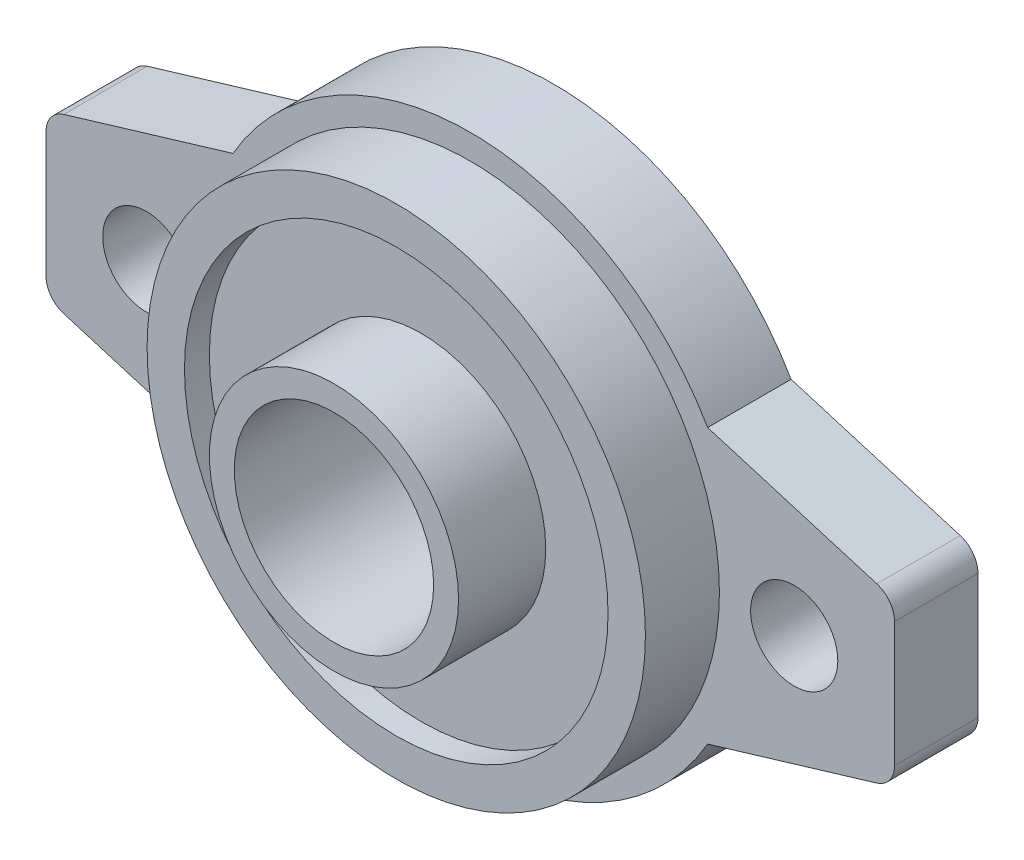
ISO-10303-21;
HEADER;
FILE_DESCRIPTION(('STEP AP214'),'2;1');
FILE_NAME('part.step','',(''),(''),'','','');
FILE_SCHEMA(('AUTOMOTIVE_DESIGN { 1 0 10303 214 1 1 1 1 }'));
ENDSEC;
DATA;
#1=APPLICATION_CONTEXT('core data for automotive mechanical design processes');
#2=APPLICATION_PROTOCOL_DEFINITION('international standard','automotive_design',2000,#1);
#3=PRODUCT_CONTEXT('',#1,'mechanical');
#4=PRODUCT('Part','Part','',(#3));
#5=PRODUCT_RELATED_PRODUCT_CATEGORY('part','',(#4));
#6=PRODUCT_DEFINITION_FORMATION('','',#4);
#7=PRODUCT_DEFINITION_CONTEXT('part definition',#1,'design');
#8=PRODUCT_DEFINITION('design','',#6,#7);
#9=PRODUCT_DEFINITION_SHAPE('','',#8);
#10=(LENGTH_UNIT() NAMED_UNIT(*) SI_UNIT(.MILLI.,.METRE.));
#11=(NAMED_UNIT(*) PLANE_ANGLE_UNIT() SI_UNIT($,.RADIAN.));
#12=(NAMED_UNIT(*) SI_UNIT($,.STERADIAN.) SOLID_ANGLE_UNIT());
#13=UNCERTAINTY_MEASURE_WITH_UNIT(LENGTH_MEASURE(1.E-05),#10,'distance_accuracy_value','');
#14=(GEOMETRIC_REPRESENTATION_CONTEXT(3) GLOBAL_UNCERTAINTY_ASSIGNED_CONTEXT((#13)) GLOBAL_UNIT_ASSIGNED_CONTEXT((#10,
#11,#12)) REPRESENTATION_CONTEXT('',''));
#15=CARTESIAN_POINT('',(0.,0.,0.));
#16=DIRECTION('',(0.,0.,1.));
#17=DIRECTION('',(1.,0.,0.));
#18=AXIS2_PLACEMENT_3D('',#15,#16,#17);
#19=CARTESIAN_POINT('',(0.,0.,6.7));
#20=DIRECTION('',(0.,0.,-1.));
#21=DIRECTION('',(-1.,0.,0.));
#22=AXIS2_PLACEMENT_3D('',#19,#20,#21);
#23=CYLINDRICAL_SURFACE('',#22,22.);
#24=CARTESIAN_POINT('',(0.,0.,0.));
#25=DIRECTION('',(0.,0.,1.));
#26=DIRECTION('',(1.,0.,0.));
#27=AXIS2_PLACEMENT_3D('',#24,#25,#26);
#28=CIRCLE('',#27,22.);
#29=CARTESIAN_POINT('',(-19.0525588832576,-11.,0.));
#30=VERTEX_POINT('',#29);
#31=CARTESIAN_POINT('',(19.0525588832577,-11.,0.));
#32=VERTEX_POINT('',#31);
#33=EDGE_CURVE('E313',#30,#32,#28,.T.);
#34=ORIENTED_EDGE('',*,*,#33,.T.);
#35=DIRECTION('',(0.,0.,-1.));
#36=VECTOR('',#35,1.);
#37=CARTESIAN_POINT('',(19.0525588832577,-11.,6.7));
#38=LINE('',#37,#36);
#39=CARTESIAN_POINT('',(19.0525588832577,-11.,6.7));
#40=VERTEX_POINT('',#39);
#41=EDGE_CURVE('E217',#40,#32,#38,.T.);
#42=ORIENTED_EDGE('',*,*,#41,.F.);
#43=CARTESIAN_POINT('',(0.,0.,6.7));
#44=DIRECTION('',(0.,0.,1.));
#45=DIRECTION('',(1.,0.,0.));
#46=AXIS2_PLACEMENT_3D('',#43,#44,#45);
#47=CIRCLE('',#46,22.);
#48=CARTESIAN_POINT('',(-19.0525588832576,-11.,6.7));
#49=VERTEX_POINT('',#48);
#50=EDGE_CURVE('E201',#49,#40,#47,.T.);
#51=ORIENTED_EDGE('',*,*,#50,.F.);
#52=DIRECTION('',(0.,0.,-1.));
#53=VECTOR('',#52,1.);
#54=CARTESIAN_POINT('',(-19.0525588832576,-11.,6.7));
#55=LINE('',#54,#53);
#56=EDGE_CURVE('E215',#49,#30,#55,.T.);
#57=ORIENTED_EDGE('',*,*,#56,.T.);
#58=EDGE_LOOP('',(#34,#42,#51,#57));
#59=FACE_BOUND('',#58,.T.);
#60=ADVANCED_FACE('F103',(#59),#23,.T.);
#61=CARTESIAN_POINT('',(4.60066999953504,-15.3355666651168,6.7));
#62=DIRECTION('',(0.287347885566346,-0.957826285221151,0.));
#63=DIRECTION('',(0.957826285221151,0.287347885566346,0.));
#64=AXIS2_PLACEMENT_3D('',#61,#62,#63);
#65=PLANE('',#64);
#66=DIRECTION('',(-0.957826285221151,-0.287347885566345,0.));
#67=VECTOR('',#66,1.);
#68=CARTESIAN_POINT('',(4.60066999953504,-15.3355666651168,0.));
#69=LINE('',#68,#67);
#70=CARTESIAN_POINT('',(32.6272546543903,-6.9275912686602,0.));
#71=VERTEX_POINT('',#70);
#72=EDGE_CURVE('E287',#71,#32,#69,.T.);
#73=ORIENTED_EDGE('',*,*,#72,.F.);
#74=DIRECTION('',(0.,0.,-1.));
#75=VECTOR('',#74,1.);
#76=CARTESIAN_POINT('',(32.6272546543903,-6.9275912686602,6.7));
#77=LINE('',#76,#75);
#78=CARTESIAN_POINT('',(32.6272546543903,-6.9275912686602,6.7));
#79=VERTEX_POINT('',#78);
#80=EDGE_CURVE('E112',#71,#79,#77,.F.);
#81=ORIENTED_EDGE('',*,*,#80,.T.);
#82=DIRECTION('',(-0.957826285221151,-0.287347885566345,0.));
#83=VECTOR('',#82,1.);
#84=CARTESIAN_POINT('',(4.60066999953504,-15.3355666651168,6.7));
#85=LINE('',#84,#83);
#86=EDGE_CURVE('E219',#79,#40,#85,.T.);
#87=ORIENTED_EDGE('',*,*,#86,.T.);
#88=ORIENTED_EDGE('',*,*,#41,.T.);
#89=EDGE_LOOP('',(#73,#81,#87,#88));
#90=FACE_BOUND('',#89,.T.);
#91=ADVANCED_FACE('F286',(#90),#65,.T.);
#92=CARTESIAN_POINT('',(34.0525588832577,0.,6.7));
#93=DIRECTION('',(1.,0.,0.));
#94=DIRECTION('',(0.,0.,-1.));
#95=AXIS2_PLACEMENT_3D('',#92,#93,#94);
#96=PLANE('',#95);
#97=DIRECTION('',(0.,-1.,0.));
#98=VECTOR('',#97,1.);
#99=CARTESIAN_POINT('',(34.0525588832577,0.,6.7));
#100=LINE('',#99,#98);
#101=CARTESIAN_POINT('',(34.0525588832577,5.01193869821789,6.7));
#102=VERTEX_POINT('',#101);
#103=CARTESIAN_POINT('',(34.0525588832577,-5.01193869821789,6.7));
#104=VERTEX_POINT('',#103);
#105=EDGE_CURVE('E292',#102,#104,#100,.T.);
#106=ORIENTED_EDGE('',*,*,#105,.T.);
#107=DIRECTION('',(0.,0.,-1.));
#108=VECTOR('',#107,1.);
#109=CARTESIAN_POINT('',(34.0525588832577,-5.01193869821789,6.7));
#110=LINE('',#109,#108);
#111=CARTESIAN_POINT('',(34.0525588832577,-5.01193869821789,0.));
#112=VERTEX_POINT('',#111);
#113=EDGE_CURVE('E279',#104,#112,#110,.T.);
#114=ORIENTED_EDGE('',*,*,#113,.T.);
#115=DIRECTION('',(0.,-1.,0.));
#116=VECTOR('',#115,1.);
#117=CARTESIAN_POINT('',(34.0525588832577,0.,0.));
#118=LINE('',#117,#116);
#119=CARTESIAN_POINT('',(34.0525588832577,5.01193869821789,0.));
#120=VERTEX_POINT('',#119);
#121=EDGE_CURVE('E300',#120,#112,#118,.T.);
#122=ORIENTED_EDGE('',*,*,#121,.F.);
#123=DIRECTION('',(0.,0.,-1.));
#124=VECTOR('',#123,1.);
#125=CARTESIAN_POINT('',(34.0525588832577,5.01193869821789,6.7));
#126=LINE('',#125,#124);
#127=EDGE_CURVE('E276',#120,#102,#126,.F.);
#128=ORIENTED_EDGE('',*,*,#127,.T.);
#129=EDGE_LOOP('',(#106,#114,#122,#128));
#130=FACE_BOUND('',#129,.T.);
#131=ADVANCED_FACE('F299',(#130),#96,.T.);
#132=CARTESIAN_POINT('',(4.60066999953503,15.3355666651168,6.7));
#133=DIRECTION('',(0.287347885566345,0.957826285221151,0.));
#134=DIRECTION('',(-0.957826285221151,0.287347885566345,0.));
#135=AXIS2_PLACEMENT_3D('',#132,#133,#134);
#136=PLANE('',#135);
#137=DIRECTION('',(0.957826285221151,-0.287347885566345,0.));
#138=VECTOR('',#137,1.);
#139=CARTESIAN_POINT('',(4.60066999953503,15.3355666651168,6.7));
#140=LINE('',#139,#138);
#141=CARTESIAN_POINT('',(19.0525588832577,11.,6.7));
#142=VERTEX_POINT('',#141);
#143=CARTESIAN_POINT('',(32.6272546543904,6.92759126866019,6.7));
#144=VERTEX_POINT('',#143);
#145=EDGE_CURVE('E343',#142,#144,#140,.T.);
#146=ORIENTED_EDGE('',*,*,#145,.T.);
#147=DIRECTION('',(0.,0.,-1.));
#148=VECTOR('',#147,1.);
#149=CARTESIAN_POINT('',(32.6272546543904,6.92759126866019,6.7));
#150=LINE('',#149,#148);
#151=CARTESIAN_POINT('',(32.6272546543904,6.92759126866019,0.));
#152=VERTEX_POINT('',#151);
#153=EDGE_CURVE('E13',#144,#152,#150,.T.);
#154=ORIENTED_EDGE('',*,*,#153,.T.);
#155=DIRECTION('',(0.957826285221151,-0.287347885566345,0.));
#156=VECTOR('',#155,1.);
#157=CARTESIAN_POINT('',(4.60066999953503,15.3355666651168,0.));
#158=LINE('',#157,#156);
#159=CARTESIAN_POINT('',(19.0525588832577,11.,0.));
#160=VERTEX_POINT('',#159);
#161=EDGE_CURVE('E307',#160,#152,#158,.T.);
#162=ORIENTED_EDGE('',*,*,#161,.F.);
#163=DIRECTION('',(0.,0.,-1.));
#164=VECTOR('',#163,1.);
#165=CARTESIAN_POINT('',(19.0525588832577,11.,6.7));
#166=LINE('',#165,#164);
#167=EDGE_CURVE('E233',#142,#160,#166,.T.);
#168=ORIENTED_EDGE('',*,*,#167,.F.);
#169=EDGE_LOOP('',(#146,#154,#162,#168));
#170=FACE_BOUND('',#169,.T.);
#171=ADVANCED_FACE('F341',(#170),#136,.T.);
#172=CARTESIAN_POINT('',(0.,0.,6.7));
#173=DIRECTION('',(0.,0.,-1.));
#174=DIRECTION('',(-1.,0.,0.));
#175=AXIS2_PLACEMENT_3D('',#172,#173,#174);
#176=CYLINDRICAL_SURFACE('',#175,22.);
#177=CARTESIAN_POINT('',(0.,0.,0.));
#178=DIRECTION('',(0.,0.,1.));
#179=DIRECTION('',(1.,0.,0.));
#180=AXIS2_PLACEMENT_3D('',#177,#178,#179);
#181=CIRCLE('',#180,22.);
#182=CARTESIAN_POINT('',(-19.0525588832577,11.,0.));
#183=VERTEX_POINT('',#182);
#184=EDGE_CURVE('E311',#160,#183,#181,.T.);
#185=ORIENTED_EDGE('',*,*,#184,.T.);
#186=DIRECTION('',(0.,0.,-1.));
#187=VECTOR('',#186,1.);
#188=CARTESIAN_POINT('',(-19.0525588832577,11.,6.7));
#189=LINE('',#188,#187);
#190=CARTESIAN_POINT('',(-19.0525588832577,11.,6.7));
#191=VERTEX_POINT('',#190);
#192=EDGE_CURVE('E327',#191,#183,#189,.T.);
#193=ORIENTED_EDGE('',*,*,#192,.F.);
#194=CARTESIAN_POINT('',(0.,0.,6.7));
#195=DIRECTION('',(0.,0.,1.));
#196=DIRECTION('',(1.,0.,0.));
#197=AXIS2_PLACEMENT_3D('',#194,#195,#196);
#198=CIRCLE('',#197,22.);
#199=EDGE_CURVE('E337',#142,#191,#198,.T.);
#200=ORIENTED_EDGE('',*,*,#199,.F.);
#201=ORIENTED_EDGE('',*,*,#167,.T.);
#202=EDGE_LOOP('',(#185,#193,#200,#201));
#203=FACE_BOUND('',#202,.T.);
#204=ADVANCED_FACE('F335',(#203),#176,.T.);
#205=CARTESIAN_POINT('',(-4.60066999953503,15.3355666651168,6.7));
#206=DIRECTION('',(0.287347885566345,-0.957826285221151,0.));
#207=DIRECTION('',(0.957826285221151,0.287347885566345,0.));
#208=AXIS2_PLACEMENT_3D('',#205,#206,#207);
#209=PLANE('',#208);
#210=DIRECTION('',(-0.957826285221151,-0.287347885566345,0.));
#211=VECTOR('',#210,1.);
#212=CARTESIAN_POINT('',(-4.60066999953503,15.3355666651168,0.));
#213=LINE('',#212,#211);
#214=CARTESIAN_POINT('',(-32.6272546543904,6.92759126866018,0.));
#215=VERTEX_POINT('',#214);
#216=EDGE_CURVE('E319',#183,#215,#213,.T.);
#217=ORIENTED_EDGE('',*,*,#216,.T.);
#218=DIRECTION('',(0.,0.,-1.));
#219=VECTOR('',#218,1.);
#220=CARTESIAN_POINT('',(-32.6272546543904,6.92759126866018,6.7));
#221=LINE('',#220,#219);
#222=CARTESIAN_POINT('',(-32.6272546543904,6.92759126866018,6.7));
#223=VERTEX_POINT('',#222);
#224=EDGE_CURVE('E119',#215,#223,#221,.F.);
#225=ORIENTED_EDGE('',*,*,#224,.T.);
#226=DIRECTION('',(-0.957826285221151,-0.287347885566345,0.));
#227=VECTOR('',#226,1.);
#228=CARTESIAN_POINT('',(-4.60066999953503,15.3355666651168,6.7));
#229=LINE('',#228,#227);
#230=EDGE_CURVE('E352',#191,#223,#229,.T.);
#231=ORIENTED_EDGE('',*,*,#230,.F.);
#232=ORIENTED_EDGE('',*,*,#192,.T.);
#233=EDGE_LOOP('',(#217,#225,#231,#232));
#234=FACE_BOUND('',#233,.T.);
#235=ADVANCED_FACE('F482',(#234),#209,.F.);
#236=CARTESIAN_POINT('',(-34.0525588832577,0.,6.7));
#237=DIRECTION('',(1.,0.,0.));
#238=DIRECTION('',(0.,0.,-1.));
#239=AXIS2_PLACEMENT_3D('',#236,#237,#238);
#240=PLANE('',#239);
#241=DIRECTION('',(0.,-1.,0.));
#242=VECTOR('',#241,1.);
#243=CARTESIAN_POINT('',(-34.0525588832577,0.,0.));
#244=LINE('',#243,#242);
#245=CARTESIAN_POINT('',(-34.0525588832577,5.01193869821788,0.));
#246=VERTEX_POINT('',#245);
#247=CARTESIAN_POINT('',(-34.0525588832577,-5.0119386982179,0.));
#248=VERTEX_POINT('',#247);
#249=EDGE_CURVE('E322',#246,#248,#244,.T.);
#250=ORIENTED_EDGE('',*,*,#249,.T.);
#251=DIRECTION('',(0.,0.,-1.));
#252=VECTOR('',#251,1.);
#253=CARTESIAN_POINT('',(-34.0525588832577,-5.0119386982179,6.7));
#254=LINE('',#253,#252);
#255=CARTESIAN_POINT('',(-34.0525588832577,-5.0119386982179,6.7));
#256=VERTEX_POINT('',#255);
#257=EDGE_CURVE('E261',#248,#256,#254,.F.);
#258=ORIENTED_EDGE('',*,*,#257,.T.);
#259=DIRECTION('',(0.,-1.,0.));
#260=VECTOR('',#259,1.);
#261=CARTESIAN_POINT('',(-34.0525588832577,0.,6.7));
#262=LINE('',#261,#260);
#263=CARTESIAN_POINT('',(-34.0525588832577,5.01193869821788,6.7));
#264=VERTEX_POINT('',#263);
#265=EDGE_CURVE('E330',#264,#256,#262,.T.);
#266=ORIENTED_EDGE('',*,*,#265,.F.);
#267=DIRECTION('',(0.,0.,-1.));
#268=VECTOR('',#267,1.);
#269=CARTESIAN_POINT('',(-34.0525588832577,5.01193869821788,6.7));
#270=LINE('',#269,#268);
#271=EDGE_CURVE('E257',#264,#246,#270,.T.);
#272=ORIENTED_EDGE('',*,*,#271,.T.);
#273=EDGE_LOOP('',(#250,#258,#266,#272));
#274=FACE_BOUND('',#273,.T.);
#275=ADVANCED_FACE('F370',(#274),#240,.F.);
#276=CARTESIAN_POINT('',(-4.60066999953503,-15.3355666651168,6.7));
#277=DIRECTION('',(0.287347885566345,0.957826285221151,0.));
#278=DIRECTION('',(-0.957826285221152,0.287347885566345,0.));
#279=AXIS2_PLACEMENT_3D('',#276,#277,#278);
#280=PLANE('',#279);
#281=DIRECTION('',(0.957826285221152,-0.287347885566345,0.));
#282=VECTOR('',#281,1.);
#283=CARTESIAN_POINT('',(-4.60066999953503,-15.3355666651168,6.7));
#284=LINE('',#283,#282);
#285=CARTESIAN_POINT('',(-32.6272546543904,-6.9275912686602,6.7));
#286=VERTEX_POINT('',#285);
#287=EDGE_CURVE('E196',#286,#49,#284,.T.);
#288=ORIENTED_EDGE('',*,*,#287,.F.);
#289=DIRECTION('',(0.,0.,-1.));
#290=VECTOR('',#289,1.);
#291=CARTESIAN_POINT('',(-32.6272546543903,-6.9275912686602,6.7));
#292=LINE('',#291,#290);
#293=CARTESIAN_POINT('',(-32.6272546543904,-6.9275912686602,0.));
#294=VERTEX_POINT('',#293);
#295=EDGE_CURVE('E231',#286,#294,#292,.T.);
#296=ORIENTED_EDGE('',*,*,#295,.T.);
#297=DIRECTION('',(0.957826285221152,-0.287347885566345,0.));
#298=VECTOR('',#297,1.);
#299=CARTESIAN_POINT('',(-4.60066999953503,-15.3355666651168,0.));
#300=LINE('',#299,#298);
#301=EDGE_CURVE('E223',#294,#30,#300,.T.);
#302=ORIENTED_EDGE('',*,*,#301,.T.);
#303=ORIENTED_EDGE('',*,*,#56,.F.);
#304=EDGE_LOOP('',(#288,#296,#302,#303));
#305=FACE_BOUND('',#304,.T.);
#306=ADVANCED_FACE('F221',(#305),#280,.F.);
#307=CARTESIAN_POINT('',(26.,0.,6.7));
#308=DIRECTION('',(0.,0.,-1.));
#309=DIRECTION('',(-1.,0.,0.));
#310=AXIS2_PLACEMENT_3D('',#307,#308,#309);
#311=CYLINDRICAL_SURFACE('',#310,3.5);
#312=CARTESIAN_POINT('',(26.,0.,6.7));
#313=DIRECTION('',(0.,0.,1.));
#314=DIRECTION('',(1.,0.,0.));
#315=AXIS2_PLACEMENT_3D('',#312,#313,#314);
#316=CIRCLE('',#315,3.5);
#317=CARTESIAN_POINT('',(29.5,0.,6.7));
#318=VERTEX_POINT('',#317);
#319=EDGE_CURVE('E210',#318,#318,#316,.T.);
#320=ORIENTED_EDGE('',*,*,#319,.T.);
#321=EDGE_LOOP('',(#320));
#322=FACE_BOUND('',#321,.T.);
#323=CARTESIAN_POINT('',(26.,0.,0.));
#324=DIRECTION('',(0.,0.,1.));
#325=DIRECTION('',(1.,0.,0.));
#326=AXIS2_PLACEMENT_3D('',#323,#324,#325);
#327=CIRCLE('',#326,3.5);
#328=CARTESIAN_POINT('',(29.5,0.,0.));
#329=VERTEX_POINT('',#328);
#330=EDGE_CURVE('E360',#329,#329,#327,.T.);
#331=ORIENTED_EDGE('',*,*,#330,.F.);
#332=EDGE_LOOP('',(#331));
#333=FACE_BOUND('',#332,.T.);
#334=ADVANCED_FACE('F398',(#322,#333),#311,.F.);
#335=CARTESIAN_POINT('',(-26.,0.,6.7));
#336=DIRECTION('',(0.,0.,-1.));
#337=DIRECTION('',(-1.,0.,0.));
#338=AXIS2_PLACEMENT_3D('',#335,#336,#337);
#339=CYLINDRICAL_SURFACE('',#338,3.5);
#340=CARTESIAN_POINT('',(-26.,0.,6.7));
#341=DIRECTION('',(0.,0.,1.));
#342=DIRECTION('',(1.,0.,0.));
#343=AXIS2_PLACEMENT_3D('',#340,#341,#342);
#344=CIRCLE('',#343,3.5);
#345=CARTESIAN_POINT('',(-22.5,0.,6.7));
#346=VERTEX_POINT('',#345);
#347=EDGE_CURVE('E326',#346,#346,#344,.F.);
#348=ORIENTED_EDGE('',*,*,#347,.F.);
#349=EDGE_LOOP('',(#348));
#350=FACE_BOUND('',#349,.T.);
#351=CARTESIAN_POINT('',(-26.,0.,0.));
#352=DIRECTION('',(0.,0.,1.));
#353=DIRECTION('',(1.,0.,0.));
#354=AXIS2_PLACEMENT_3D('',#351,#352,#353);
#355=CIRCLE('',#354,3.5);
#356=CARTESIAN_POINT('',(-22.5,0.,0.));
#357=VERTEX_POINT('',#356);
#358=EDGE_CURVE('E240',#357,#357,#355,.F.);
#359=ORIENTED_EDGE('',*,*,#358,.T.);
#360=EDGE_LOOP('',(#359));
#361=FACE_BOUND('',#360,.T.);
#362=ADVANCED_FACE('F400',(#350,#361),#339,.F.);
#363=CARTESIAN_POINT('',(0.,0.,0.));
#364=DIRECTION('',(0.,0.,1.));
#365=DIRECTION('',(1.,0.,0.));
#366=AXIS2_PLACEMENT_3D('',#363,#364,#365);
#367=PLANE('',#366);
#368=ORIENTED_EDGE('',*,*,#358,.F.);
#369=EDGE_LOOP('',(#368));
#370=FACE_BOUND('',#369,.T.);
#371=ORIENTED_EDGE('',*,*,#330,.T.);
#372=EDGE_LOOP('',(#371));
#373=FACE_BOUND('',#372,.T.);
#374=ORIENTED_EDGE('',*,*,#301,.F.);
#375=CARTESIAN_POINT('',(-32.0525588832577,-5.0119386982179,0.));
#376=DIRECTION('',(0.,0.,1.));
#377=DIRECTION('',(1.,0.,0.));
#378=AXIS2_PLACEMENT_3D('',#375,#376,#377);
#379=CIRCLE('',#378,2.);
#380=EDGE_CURVE('E254',#294,#248,#379,.F.);
#381=ORIENTED_EDGE('',*,*,#380,.T.);
#382=ORIENTED_EDGE('',*,*,#249,.F.);
#383=CARTESIAN_POINT('',(-32.0525588832577,5.01193869821788,0.));
#384=DIRECTION('',(0.,0.,1.));
#385=DIRECTION('',(1.,0.,0.));
#386=AXIS2_PLACEMENT_3D('',#383,#384,#385);
#387=CIRCLE('',#386,2.);
#388=EDGE_CURVE('E251',#246,#215,#387,.F.);
#389=ORIENTED_EDGE('',*,*,#388,.T.);
#390=ORIENTED_EDGE('',*,*,#216,.F.);
#391=ORIENTED_EDGE('',*,*,#184,.F.);
#392=ORIENTED_EDGE('',*,*,#161,.T.);
#393=CARTESIAN_POINT('',(32.0525588832577,5.01193869821789,0.));
#394=DIRECTION('',(0.,0.,1.));
#395=DIRECTION('',(1.,0.,0.));
#396=AXIS2_PLACEMENT_3D('',#393,#394,#395);
#397=CIRCLE('',#396,2.);
#398=EDGE_CURVE('E245',#152,#120,#397,.F.);
#399=ORIENTED_EDGE('',*,*,#398,.T.);
#400=ORIENTED_EDGE('',*,*,#121,.T.);
#401=CARTESIAN_POINT('',(32.0525588832577,-5.01193869821789,0.));
#402=DIRECTION('',(0.,0.,1.));
#403=DIRECTION('',(1.,0.,0.));
#404=AXIS2_PLACEMENT_3D('',#401,#402,#403);
#405=CIRCLE('',#404,2.);
#406=EDGE_CURVE('E248',#112,#71,#405,.F.);
#407=ORIENTED_EDGE('',*,*,#406,.T.);
#408=ORIENTED_EDGE('',*,*,#72,.T.);
#409=ORIENTED_EDGE('',*,*,#33,.F.);
#410=EDGE_LOOP('',(#374,#381,#382,#389,#390,#391,#392,#399,#400,#407,#408,#409));
#411=FACE_BOUND('',#410,.T.);
#412=CARTESIAN_POINT('',(0.,0.,0.));
#413=DIRECTION('',(0.,0.,1.));
#414=DIRECTION('',(1.,0.,0.));
#415=AXIS2_PLACEMENT_3D('',#412,#413,#414);
#416=CIRCLE('',#415,8.);
#417=CARTESIAN_POINT('',(8.,0.,0.));
#418=VERTEX_POINT('',#417);
#419=EDGE_CURVE('E439',#418,#418,#416,.T.);
#420=ORIENTED_EDGE('',*,*,#419,.T.);
#421=EDGE_LOOP('',(#420));
#422=FACE_BOUND('',#421,.T.);
#423=ADVANCED_FACE('F303',(#370,#373,#411,#422),#367,.F.);
#424=CARTESIAN_POINT('',(0.,0.,6.7));
#425=DIRECTION('',(0.,0.,1.));
#426=DIRECTION('',(1.,0.,0.));
#427=AXIS2_PLACEMENT_3D('',#424,#425,#426);
#428=PLANE('',#427);
#429=CARTESIAN_POINT('',(0.,0.,6.7));
#430=DIRECTION('',(0.,0.,1.));
#431=DIRECTION('',(1.,0.,0.));
#432=AXIS2_PLACEMENT_3D('',#429,#430,#431);
#433=CIRCLE('',#432,20.);
#434=CARTESIAN_POINT('',(-20.,0.,6.7));
#435=VERTEX_POINT('',#434);
#436=EDGE_CURVE('E237',#435,#435,#433,.F.);
#437=ORIENTED_EDGE('',*,*,#436,.T.);
#438=EDGE_LOOP('',(#437));
#439=FACE_BOUND('',#438,.T.);
#440=ORIENTED_EDGE('',*,*,#347,.T.);
#441=EDGE_LOOP('',(#440));
#442=FACE_BOUND('',#441,.T.);
#443=ORIENTED_EDGE('',*,*,#319,.F.);
#444=EDGE_LOOP('',(#443));
#445=FACE_BOUND('',#444,.T.);
#446=ORIENTED_EDGE('',*,*,#265,.T.);
#447=CARTESIAN_POINT('',(-32.0525588832577,-5.0119386982179,6.7));
#448=DIRECTION('',(0.,0.,1.));
#449=DIRECTION('',(1.,0.,0.));
#450=AXIS2_PLACEMENT_3D('',#447,#448,#449);
#451=CIRCLE('',#450,2.);
#452=EDGE_CURVE('E204',#256,#286,#451,.T.);
#453=ORIENTED_EDGE('',*,*,#452,.T.);
#454=ORIENTED_EDGE('',*,*,#287,.T.);
#455=ORIENTED_EDGE('',*,*,#50,.T.);
#456=ORIENTED_EDGE('',*,*,#86,.F.);
#457=CARTESIAN_POINT('',(32.0525588832577,-5.01193869821789,6.7));
#458=DIRECTION('',(0.,0.,1.));
#459=DIRECTION('',(1.,0.,0.));
#460=AXIS2_PLACEMENT_3D('',#457,#458,#459);
#461=CIRCLE('',#460,2.);
#462=EDGE_CURVE('E266',#79,#104,#461,.T.);
#463=ORIENTED_EDGE('',*,*,#462,.T.);
#464=ORIENTED_EDGE('',*,*,#105,.F.);
#465=CARTESIAN_POINT('',(32.0525588832577,5.01193869821789,6.7));
#466=DIRECTION('',(0.,0.,1.));
#467=DIRECTION('',(1.,0.,0.));
#468=AXIS2_PLACEMENT_3D('',#465,#466,#467);
#469=CIRCLE('',#468,2.);
#470=EDGE_CURVE('E127',#102,#144,#469,.T.);
#471=ORIENTED_EDGE('',*,*,#470,.T.);
#472=ORIENTED_EDGE('',*,*,#145,.F.);
#473=ORIENTED_EDGE('',*,*,#199,.T.);
#474=ORIENTED_EDGE('',*,*,#230,.T.);
#475=CARTESIAN_POINT('',(-32.0525588832577,5.01193869821788,6.7));
#476=DIRECTION('',(0.,0.,1.));
#477=DIRECTION('',(1.,0.,0.));
#478=AXIS2_PLACEMENT_3D('',#475,#476,#477);
#479=CIRCLE('',#478,2.);
#480=EDGE_CURVE('E269',#223,#264,#479,.T.);
#481=ORIENTED_EDGE('',*,*,#480,.T.);
#482=EDGE_LOOP('',(#446,#453,#454,#455,#456,#463,#464,#471,#472,#473,#474,#481));
#483=FACE_BOUND('',#482,.T.);
#484=ADVANCED_FACE('F199',(#439,#442,#445,#483),#428,.T.);
#485=CARTESIAN_POINT('',(0.,0.,12.64));
#486=DIRECTION('',(0.,0.,-1.));
#487=DIRECTION('',(-1.,0.,0.));
#488=AXIS2_PLACEMENT_3D('',#485,#486,#487);
#489=CYLINDRICAL_SURFACE('',#488,17.);
#490=CARTESIAN_POINT('',(0.,0.,10.64));
#491=DIRECTION('',(0.,0.,1.));
#492=DIRECTION('',(1.,0.,0.));
#493=AXIS2_PLACEMENT_3D('',#490,#491,#492);
#494=CIRCLE('',#493,17.);
#495=CARTESIAN_POINT('',(-17.,0.,10.64));
#496=VERTEX_POINT('',#495);
#497=EDGE_CURVE('E226',#496,#496,#494,.T.);
#498=CARTESIAN_POINT('',(0.,0.,12.64));
#499=DIRECTION('',(0.,0.,1.));
#500=DIRECTION('',(1.,0.,0.));
#501=AXIS2_PLACEMENT_3D('',#498,#499,#500);
#502=CIRCLE('',#501,17.);
#503=CARTESIAN_POINT('',(-17.,0.,12.64));
#504=VERTEX_POINT('',#503);
#505=EDGE_CURVE('E426',#504,#504,#502,.T.);
#506=CARTESIAN_POINT('',(-17.,0.,10.64));
#507=CARTESIAN_POINT('',(-17.,0.,10.6608333333333));
#508=CARTESIAN_POINT('',(-17.,0.,10.6816666666667));
#509=CARTESIAN_POINT('',(-17.,0.,10.7233333333333));
#510=CARTESIAN_POINT('',(-17.,0.,10.7441666666667));
#511=CARTESIAN_POINT('',(-17.,0.,10.7858333333333));
#512=CARTESIAN_POINT('',(-17.,0.,10.8066666666667));
#513=CARTESIAN_POINT('',(-17.,0.,10.8483333333333));
#514=CARTESIAN_POINT('',(-17.,0.,10.8691666666667));
#515=CARTESIAN_POINT('',(-17.,0.,10.9108333333333));
#516=CARTESIAN_POINT('',(-17.,0.,10.9316666666667));
#517=CARTESIAN_POINT('',(-17.,0.,10.9733333333333));
#518=CARTESIAN_POINT('',(-17.,0.,10.9941666666667));
#519=CARTESIAN_POINT('',(-17.,0.,11.0358333333333));
#520=CARTESIAN_POINT('',(-17.,0.,11.0566666666667));
#521=CARTESIAN_POINT('',(-17.,0.,11.0983333333333));
#522=CARTESIAN_POINT('',(-17.,0.,11.1191666666667));
#523=CARTESIAN_POINT('',(-17.,0.,11.1608333333333));
#524=CARTESIAN_POINT('',(-17.,0.,11.1816666666667));
#525=CARTESIAN_POINT('',(-17.,0.,11.2233333333333));
#526=CARTESIAN_POINT('',(-17.,0.,11.2441666666667));
#527=CARTESIAN_POINT('',(-17.,0.,11.2858333333333));
#528=CARTESIAN_POINT('',(-17.,0.,11.3066666666667));
#529=CARTESIAN_POINT('',(-17.,0.,11.3483333333333));
#530=CARTESIAN_POINT('',(-17.,0.,11.3691666666667));
#531=CARTESIAN_POINT('',(-17.,0.,11.4108333333333));
#532=CARTESIAN_POINT('',(-17.,0.,11.4316666666667));
#533=CARTESIAN_POINT('',(-17.,0.,11.4733333333333));
#534=CARTESIAN_POINT('',(-17.,0.,11.4941666666667));
#535=CARTESIAN_POINT('',(-17.,0.,11.5358333333333));
#536=CARTESIAN_POINT('',(-17.,0.,11.5566666666667));
#537=CARTESIAN_POINT('',(-17.,0.,11.5983333333333));
#538=CARTESIAN_POINT('',(-17.,0.,11.6191666666667));
#539=CARTESIAN_POINT('',(-17.,0.,11.6608333333333));
#540=CARTESIAN_POINT('',(-17.,0.,11.6816666666667));
#541=CARTESIAN_POINT('',(-17.,0.,11.7233333333333));
#542=CARTESIAN_POINT('',(-17.,0.,11.7441666666667));
#543=CARTESIAN_POINT('',(-17.,0.,11.7858333333333));
#544=CARTESIAN_POINT('',(-17.,0.,11.8066666666667));
#545=CARTESIAN_POINT('',(-17.,0.,11.8483333333333));
#546=CARTESIAN_POINT('',(-17.,0.,11.8691666666667));
#547=CARTESIAN_POINT('',(-17.,0.,11.9108333333333));
#548=CARTESIAN_POINT('',(-17.,0.,11.9316666666667));
#549=CARTESIAN_POINT('',(-17.,0.,11.9733333333333));
#550=CARTESIAN_POINT('',(-17.,0.,11.9941666666667));
#551=CARTESIAN_POINT('',(-17.,0.,12.0358333333333));
#552=CARTESIAN_POINT('',(-17.,0.,12.0566666666667));
#553=CARTESIAN_POINT('',(-17.,0.,12.0983333333333));
#554=CARTESIAN_POINT('',(-17.,0.,12.1191666666667));
#555=CARTESIAN_POINT('',(-17.,0.,12.1608333333333));
#556=CARTESIAN_POINT('',(-17.,0.,12.1816666666667));
#557=CARTESIAN_POINT('',(-17.,0.,12.2233333333333));
#558=CARTESIAN_POINT('',(-17.,0.,12.2441666666667));
#559=CARTESIAN_POINT('',(-17.,0.,12.2858333333333));
#560=CARTESIAN_POINT('',(-17.,0.,12.3066666666667));
#561=CARTESIAN_POINT('',(-17.,0.,12.3483333333333));
#562=CARTESIAN_POINT('',(-17.,0.,12.3691666666667));
#563=CARTESIAN_POINT('',(-17.,0.,12.4108333333333));
#564=CARTESIAN_POINT('',(-17.,0.,12.4316666666667));
#565=CARTESIAN_POINT('',(-17.,0.,12.4733333333333));
#566=CARTESIAN_POINT('',(-17.,0.,12.4941666666667));
#567=CARTESIAN_POINT('',(-17.,0.,12.5358333333333));
#568=CARTESIAN_POINT('',(-17.,0.,12.5566666666667));
#569=CARTESIAN_POINT('',(-17.,0.,12.5983333333333));
#570=CARTESIAN_POINT('',(-17.,0.,12.6191666666667));
#571=CARTESIAN_POINT('',(-17.,0.,12.64));
#572=B_SPLINE_CURVE_WITH_KNOTS('',3,(#506,#507,#508,#509,#510,#511,#512,#513,#514,#515,#516,
#517,#518,#519,#520,#521,#522,#523,#524,#525,#526,#527,#528,#529,#530,#531,#532,#533,#534,#535,
#536,#537,#538,#539,#540,#541,#542,#543,#544,#545,#546,#547,#548,#549,#550,#551,#552,#553,#554,
#555,#556,#557,#558,#559,#560,#561,#562,#563,#564,#565,#566,#567,#568,#569,#570,#571),
.UNSPECIFIED.,.F.,.F.,(4,2,2,2,2,2,2,2,2,2,2,2,2,2,2,2,2,2,2,2,2,2,2,2,2,2,2,2,2,2,2,2,4),(0.,
0.0625000000000001,0.125,0.1875,0.25,0.3125,0.375,0.4375,0.5,0.5625,0.625000000000001,
0.687500000000001,0.750000000000001,0.812500000000001,0.875000000000001,0.937500000000001,1.,
1.0625,1.125,1.1875,1.25,1.3125,1.375,1.4375,1.5,1.5625,1.625,1.6875,1.75,1.8125,1.875,1.9375,
2.),.UNSPECIFIED.);
#573=EDGE_CURVE('BSEAM472',#496,#504,#572,.T.);
#574=ORIENTED_EDGE('',*,*,#497,.F.);
#575=ORIENTED_EDGE('',*,*,#505,.T.);
#576=ORIENTED_EDGE('',*,*,#573,.T.);
#577=ORIENTED_EDGE('',*,*,#573,.F.);
#578=EDGE_LOOP('',(#574,#576,#575,#577));
#579=FACE_BOUND('',#578,.T.);
#580=ADVANCED_FACE('F472',(#579),#489,.F.);
#581=CARTESIAN_POINT('',(0.,0.,12.64));
#582=DIRECTION('',(0.,0.,-1.));
#583=DIRECTION('',(-1.,0.,0.));
#584=AXIS2_PLACEMENT_3D('',#581,#582,#583);
#585=CYLINDRICAL_SURFACE('',#584,20.);
#586=CARTESIAN_POINT('',(0.,0.,12.64));
#587=DIRECTION('',(0.,0.,1.));
#588=DIRECTION('',(1.,0.,0.));
#589=AXIS2_PLACEMENT_3D('',#586,#587,#588);
#590=CIRCLE('',#589,20.);
#591=CARTESIAN_POINT('',(-20.,0.,12.64));
#592=VERTEX_POINT('',#591);
#593=EDGE_CURVE('E241',#592,#592,#590,.T.);
#594=CARTESIAN_POINT('',(-20.,0.,6.7));
#595=CARTESIAN_POINT('',(-20.,0.,6.761875));
#596=CARTESIAN_POINT('',(-20.,0.,6.82375));
#597=CARTESIAN_POINT('',(-20.,0.,6.9475));
#598=CARTESIAN_POINT('',(-20.,0.,7.009375));
#599=CARTESIAN_POINT('',(-20.,0.,7.133125));
#600=CARTESIAN_POINT('',(-20.,0.,7.195));
#601=CARTESIAN_POINT('',(-20.,0.,7.31875));
#602=CARTESIAN_POINT('',(-20.,0.,7.380625));
#603=CARTESIAN_POINT('',(-20.,0.,7.504375));
#604=CARTESIAN_POINT('',(-20.,0.,7.56625));
#605=CARTESIAN_POINT('',(-20.,0.,7.69));
#606=CARTESIAN_POINT('',(-20.,0.,7.751875));
#607=CARTESIAN_POINT('',(-20.,0.,7.875625));
#608=CARTESIAN_POINT('',(-20.,0.,7.9375));
#609=CARTESIAN_POINT('',(-20.,0.,8.06125));
#610=CARTESIAN_POINT('',(-20.,0.,8.123125));
#611=CARTESIAN_POINT('',(-20.,0.,8.246875));
#612=CARTESIAN_POINT('',(-20.,0.,8.30875));
#613=CARTESIAN_POINT('',(-20.,0.,8.4325));
#614=CARTESIAN_POINT('',(-20.,0.,8.494375));
#615=CARTESIAN_POINT('',(-20.,0.,8.618125));
#616=CARTESIAN_POINT('',(-20.,0.,8.68));
#617=CARTESIAN_POINT('',(-20.,0.,8.80375));
#618=CARTESIAN_POINT('',(-20.,0.,8.865625));
#619=CARTESIAN_POINT('',(-20.,0.,8.989375));
#620=CARTESIAN_POINT('',(-20.,0.,9.05125));
#621=CARTESIAN_POINT('',(-20.,0.,9.175));
#622=CARTESIAN_POINT('',(-20.,0.,9.236875));
#623=CARTESIAN_POINT('',(-20.,0.,9.360625));
#624=CARTESIAN_POINT('',(-20.,0.,9.4225));
#625=CARTESIAN_POINT('',(-20.,0.,9.54625));
#626=CARTESIAN_POINT('',(-20.,0.,9.608125));
#627=CARTESIAN_POINT('',(-20.,0.,9.731875));
#628=CARTESIAN_POINT('',(-20.,0.,9.79375));
#629=CARTESIAN_POINT('',(-20.,0.,9.9175));
#630=CARTESIAN_POINT('',(-20.,0.,9.979375));
#631=CARTESIAN_POINT('',(-20.,0.,10.103125));
#632=CARTESIAN_POINT('',(-20.,0.,10.165));
#633=CARTESIAN_POINT('',(-20.,0.,10.28875));
#634=CARTESIAN_POINT('',(-20.,0.,10.350625));
#635=CARTESIAN_POINT('',(-20.,0.,10.474375));
#636=CARTESIAN_POINT('',(-20.,0.,10.53625));
#637=CARTESIAN_POINT('',(-20.,0.,10.66));
#638=CARTESIAN_POINT('',(-20.,0.,10.721875));
#639=CARTESIAN_POINT('',(-20.,0.,10.845625));
#640=CARTESIAN_POINT('',(-20.,0.,10.9075));
#641=CARTESIAN_POINT('',(-20.,0.,11.03125));
#642=CARTESIAN_POINT('',(-20.,0.,11.093125));
#643=CARTESIAN_POINT('',(-20.,0.,11.216875));
#644=CARTESIAN_POINT('',(-20.,0.,11.27875));
#645=CARTESIAN_POINT('',(-20.,0.,11.4025));
#646=CARTESIAN_POINT('',(-20.,0.,11.464375));
#647=CARTESIAN_POINT('',(-20.,0.,11.588125));
#648=CARTESIAN_POINT('',(-20.,0.,11.65));
#649=CARTESIAN_POINT('',(-20.,0.,11.77375));
#650=CARTESIAN_POINT('',(-20.,0.,11.835625));
#651=CARTESIAN_POINT('',(-20.,0.,11.959375));
#652=CARTESIAN_POINT('',(-20.,0.,12.02125));
#653=CARTESIAN_POINT('',(-20.,0.,12.145));
#654=CARTESIAN_POINT('',(-20.,0.,12.206875));
#655=CARTESIAN_POINT('',(-20.,0.,12.330625));
#656=CARTESIAN_POINT('',(-20.,0.,12.3925));
#657=CARTESIAN_POINT('',(-20.,0.,12.51625));
#658=CARTESIAN_POINT('',(-20.,0.,12.578125));
#659=CARTESIAN_POINT('',(-20.,0.,12.64));
#660=B_SPLINE_CURVE_WITH_KNOTS('',3,(#594,#595,#596,#597,#598,#599,#600,#601,#602,#603,#604,
#605,#606,#607,#608,#609,#610,#611,#612,#613,#614,#615,#616,#617,#618,#619,#620,#621,#622,#623,
#624,#625,#626,#627,#628,#629,#630,#631,#632,#633,#634,#635,#636,#637,#638,#639,#640,#641,#642,
#643,#644,#645,#646,#647,#648,#649,#650,#651,#652,#653,#654,#655,#656,#657,#658,#659),
.UNSPECIFIED.,.F.,.F.,(4,2,2,2,2,2,2,2,2,2,2,2,2,2,2,2,2,2,2,2,2,2,2,2,2,2,2,2,2,2,2,2,4),(0.,
0.185625,0.37125,0.556875,0.7425,0.928125,1.11375,1.299375,1.485,1.670625,1.85625,2.041875,
2.2275,2.413125,2.59875,2.784375,2.97,3.155625,3.34125,3.526875,3.7125,3.898125,4.08375,
4.269375,4.455,4.640625,4.82625,5.011875,5.1975,5.383125,5.56875,5.754375,5.94),.UNSPECIFIED.);
#661=EDGE_CURVE('BSEAM468',#435,#592,#660,.T.);
#662=ORIENTED_EDGE('',*,*,#436,.F.);
#663=ORIENTED_EDGE('',*,*,#593,.F.);
#664=ORIENTED_EDGE('',*,*,#661,.T.);
#665=ORIENTED_EDGE('',*,*,#661,.F.);
#666=EDGE_LOOP('',(#662,#664,#663,#665));
#667=FACE_BOUND('',#666,.T.);
#668=ADVANCED_FACE('F468',(#667),#585,.T.);
#669=CARTESIAN_POINT('',(0.,0.,12.64));
#670=DIRECTION('',(0.,0.,1.));
#671=DIRECTION('',(1.,0.,0.));
#672=AXIS2_PLACEMENT_3D('',#669,#670,#671);
#673=PLANE('',#672);
#674=ORIENTED_EDGE('',*,*,#505,.F.);
#675=EDGE_LOOP('',(#674));
#676=FACE_BOUND('',#675,.T.);
#677=ORIENTED_EDGE('',*,*,#593,.T.);
#678=EDGE_LOOP('',(#677));
#679=FACE_BOUND('',#678,.T.);
#680=ADVANCED_FACE('F464',(#676,#679),#673,.T.);
#681=CARTESIAN_POINT('',(0.,0.,10.64));
#682=DIRECTION('',(0.,0.,1.));
#683=DIRECTION('',(1.,0.,0.));
#684=AXIS2_PLACEMENT_3D('',#681,#682,#683);
#685=PLANE('',#684);
#686=CARTESIAN_POINT('',(0.,0.,10.64));
#687=DIRECTION('',(0.,0.,1.));
#688=DIRECTION('',(1.,0.,0.));
#689=AXIS2_PLACEMENT_3D('',#686,#687,#688);
#690=CIRCLE('',#689,10.);
#691=CARTESIAN_POINT('',(10.,0.,10.64));
#692=VERTEX_POINT('',#691);
#693=EDGE_CURVE('E430',#692,#692,#690,.T.);
#694=ORIENTED_EDGE('',*,*,#693,.F.);
#695=EDGE_LOOP('',(#694));
#696=FACE_BOUND('',#695,.T.);
#697=ORIENTED_EDGE('',*,*,#497,.T.);
#698=EDGE_LOOP('',(#697));
#699=FACE_BOUND('',#698,.T.);
#700=ADVANCED_FACE('F450',(#696,#699),#685,.T.);
#701=CARTESIAN_POINT('',(0.,0.,52.9242712474619));
#702=DIRECTION('',(0.,0.,-1.));
#703=DIRECTION('',(-1.,0.,0.));
#704=AXIS2_PLACEMENT_3D('',#701,#702,#703);
#705=CYLINDRICAL_SURFACE('',#704,8.);
#706=ORIENTED_EDGE('',*,*,#419,.F.);
#707=EDGE_LOOP('',(#706));
#708=FACE_BOUND('',#707,.T.);
#709=CARTESIAN_POINT('',(0.,0.,17.64));
#710=DIRECTION('',(0.,0.,1.));
#711=DIRECTION('',(1.,0.,0.));
#712=AXIS2_PLACEMENT_3D('',#709,#710,#711);
#713=CIRCLE('',#712,8.);
#714=CARTESIAN_POINT('',(8.,0.,17.64));
#715=VERTEX_POINT('',#714);
#716=EDGE_CURVE('E435',#715,#715,#713,.T.);
#717=ORIENTED_EDGE('',*,*,#716,.T.);
#718=EDGE_LOOP('',(#717));
#719=FACE_BOUND('',#718,.T.);
#720=ADVANCED_FACE('F447',(#708,#719),#705,.F.);
#721=CARTESIAN_POINT('',(0.,0.,52.9242712474619));
#722=DIRECTION('',(0.,0.,-1.));
#723=DIRECTION('',(-1.,0.,0.));
#724=AXIS2_PLACEMENT_3D('',#721,#722,#723);
#725=CYLINDRICAL_SURFACE('',#724,10.);
#726=ORIENTED_EDGE('',*,*,#693,.T.);
#727=EDGE_LOOP('',(#726));
#728=FACE_BOUND('',#727,.T.);
#729=CARTESIAN_POINT('',(0.,0.,17.64));
#730=DIRECTION('',(0.,0.,1.));
#731=DIRECTION('',(1.,0.,0.));
#732=AXIS2_PLACEMENT_3D('',#729,#730,#731);
#733=CIRCLE('',#732,10.);
#734=CARTESIAN_POINT('',(10.,0.,17.64));
#735=VERTEX_POINT('',#734);
#736=EDGE_CURVE('E434',#735,#735,#733,.T.);
#737=ORIENTED_EDGE('',*,*,#736,.F.);
#738=EDGE_LOOP('',(#737));
#739=FACE_BOUND('',#738,.T.);
#740=ADVANCED_FACE('F384',(#728,#739),#725,.T.);
#741=CARTESIAN_POINT('',(0.,0.,17.64));
#742=DIRECTION('',(0.,0.,1.));
#743=DIRECTION('',(1.,0.,0.));
#744=AXIS2_PLACEMENT_3D('',#741,#742,#743);
#745=PLANE('',#744);
#746=ORIENTED_EDGE('',*,*,#716,.F.);
#747=EDGE_LOOP('',(#746));
#748=FACE_BOUND('',#747,.T.);
#749=ORIENTED_EDGE('',*,*,#736,.T.);
#750=EDGE_LOOP('',(#749));
#751=FACE_BOUND('',#750,.T.);
#752=ADVANCED_FACE('F376',(#748,#751),#745,.T.);
#753=CARTESIAN_POINT('',(-32.0525588832577,-5.0119386982179,6.7));
#754=DIRECTION('',(0.,0.,-1.));
#755=DIRECTION('',(-1.,0.,0.));
#756=AXIS2_PLACEMENT_3D('',#753,#754,#755);
#757=CYLINDRICAL_SURFACE('',#756,2.);
#758=ORIENTED_EDGE('',*,*,#452,.F.);
#759=ORIENTED_EDGE('',*,*,#257,.F.);
#760=ORIENTED_EDGE('',*,*,#380,.F.);
#761=ORIENTED_EDGE('',*,*,#295,.F.);
#762=EDGE_LOOP('',(#758,#759,#760,#761));
#763=FACE_BOUND('',#762,.T.);
#764=ADVANCED_FACE('F373',(#763),#757,.T.);
#765=CARTESIAN_POINT('',(-32.0525588832577,5.01193869821788,6.7));
#766=DIRECTION('',(0.,0.,-1.));
#767=DIRECTION('',(-1.,0.,0.));
#768=AXIS2_PLACEMENT_3D('',#765,#766,#767);
#769=CYLINDRICAL_SURFACE('',#768,2.);
#770=ORIENTED_EDGE('',*,*,#480,.F.);
#771=ORIENTED_EDGE('',*,*,#224,.F.);
#772=ORIENTED_EDGE('',*,*,#388,.F.);
#773=ORIENTED_EDGE('',*,*,#271,.F.);
#774=EDGE_LOOP('',(#770,#771,#772,#773));
#775=FACE_BOUND('',#774,.T.);
#776=ADVANCED_FACE('F375',(#775),#769,.T.);
#777=CARTESIAN_POINT('',(32.0525588832577,-5.01193869821789,6.7));
#778=DIRECTION('',(0.,0.,-1.));
#779=DIRECTION('',(-1.,0.,0.));
#780=AXIS2_PLACEMENT_3D('',#777,#778,#779);
#781=CYLINDRICAL_SURFACE('',#780,2.);
#782=ORIENTED_EDGE('',*,*,#462,.F.);
#783=ORIENTED_EDGE('',*,*,#80,.F.);
#784=ORIENTED_EDGE('',*,*,#406,.F.);
#785=ORIENTED_EDGE('',*,*,#113,.F.);
#786=EDGE_LOOP('',(#782,#783,#784,#785));
#787=FACE_BOUND('',#786,.T.);
#788=ADVANCED_FACE('F295',(#787),#781,.T.);
#789=CARTESIAN_POINT('',(32.0525588832577,5.01193869821789,6.7));
#790=DIRECTION('',(0.,0.,-1.));
#791=DIRECTION('',(-1.,0.,0.));
#792=AXIS2_PLACEMENT_3D('',#789,#790,#791);
#793=CYLINDRICAL_SURFACE('',#792,2.);
#794=ORIENTED_EDGE('',*,*,#470,.F.);
#795=ORIENTED_EDGE('',*,*,#127,.F.);
#796=ORIENTED_EDGE('',*,*,#398,.F.);
#797=ORIENTED_EDGE('',*,*,#153,.F.);
#798=EDGE_LOOP('',(#794,#795,#796,#797));
#799=FACE_BOUND('',#798,.T.);
#800=ADVANCED_FACE('F105',(#799),#793,.T.);
#801=CLOSED_SHELL('',(#60,#91,#131,#171,#204,#235,#275,#306,#334,#362,#423,#484,#580,#668,#680,
#700,#720,#740,#752,#764,#776,#788,#800));
#802=MANIFOLD_SOLID_BREP('B2',#801);
#803=ADVANCED_BREP_SHAPE_REPRESENTATION('',(#18,#802),#14);
#804=SHAPE_DEFINITION_REPRESENTATION(#9,#803);
ENDSEC;
END-ISO-10303-21;
